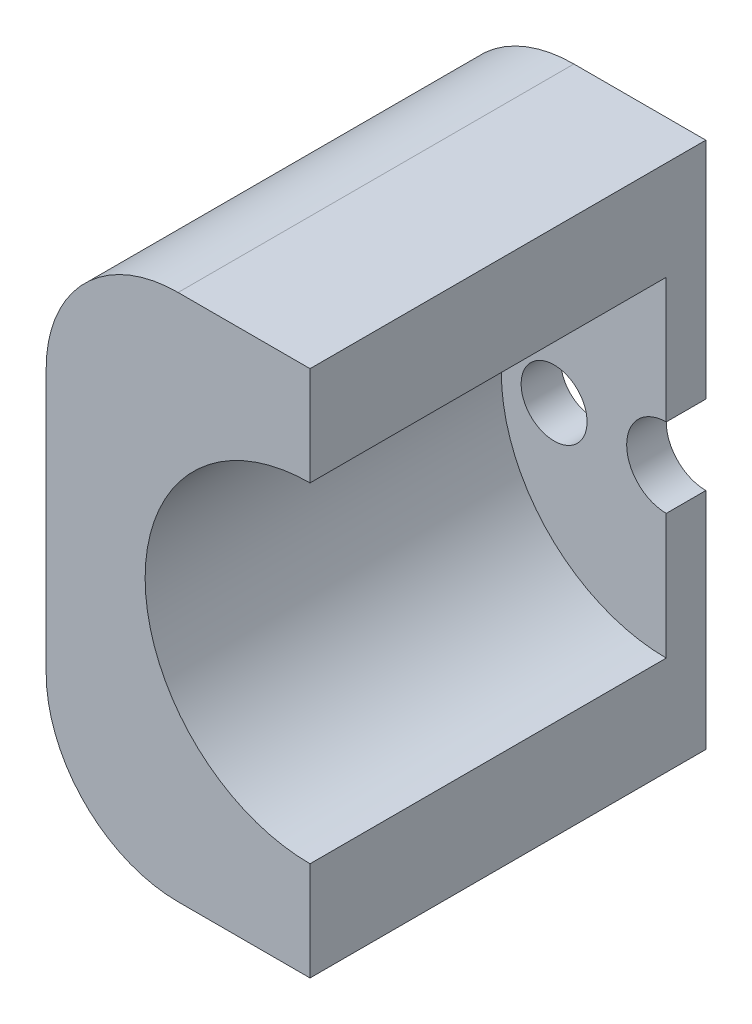
ISO-10303-21;
HEADER;
FILE_DESCRIPTION(('STEP AP214'),'2;1');
FILE_NAME('part.step','',(''),(''),'','','');
FILE_SCHEMA(('AUTOMOTIVE_DESIGN { 1 0 10303 214 1 1 1 1 }'));
ENDSEC;
DATA;
#1=APPLICATION_CONTEXT('core data for automotive mechanical design processes');
#2=APPLICATION_PROTOCOL_DEFINITION('international standard','automotive_design',2000,#1);
#3=PRODUCT_CONTEXT('',#1,'mechanical');
#4=PRODUCT('Part','Part','',(#3));
#5=PRODUCT_RELATED_PRODUCT_CATEGORY('part','',(#4));
#6=PRODUCT_DEFINITION_FORMATION('','',#4);
#7=PRODUCT_DEFINITION_CONTEXT('part definition',#1,'design');
#8=PRODUCT_DEFINITION('design','',#6,#7);
#9=PRODUCT_DEFINITION_SHAPE('','',#8);
#10=(LENGTH_UNIT() NAMED_UNIT(*) SI_UNIT(.MILLI.,.METRE.));
#11=(NAMED_UNIT(*) PLANE_ANGLE_UNIT() SI_UNIT($,.RADIAN.));
#12=(NAMED_UNIT(*) SI_UNIT($,.STERADIAN.) SOLID_ANGLE_UNIT());
#13=UNCERTAINTY_MEASURE_WITH_UNIT(LENGTH_MEASURE(1.E-05),#10,'distance_accuracy_value','');
#14=(GEOMETRIC_REPRESENTATION_CONTEXT(3) GLOBAL_UNCERTAINTY_ASSIGNED_CONTEXT((#13)) GLOBAL_UNIT_ASSIGNED_CONTEXT((#10,
#11,#12)) REPRESENTATION_CONTEXT('',''));
#15=CARTESIAN_POINT('',(0.,0.,0.));
#16=DIRECTION('',(0.,0.,1.));
#17=DIRECTION('',(1.,0.,0.));
#18=AXIS2_PLACEMENT_3D('',#15,#16,#17);
#19=CARTESIAN_POINT('',(0.,0.,30.));
#20=DIRECTION('',(0.,0.,-1.));
#21=DIRECTION('',(-1.,0.,0.));
#22=AXIS2_PLACEMENT_3D('',#19,#20,#21);
#23=CYLINDRICAL_SURFACE('',#22,12.5);
#24=CARTESIAN_POINT('',(0.,0.,3.));
#25=DIRECTION('',(0.,0.,-1.));
#26=DIRECTION('',(-1.,0.,0.));
#27=AXIS2_PLACEMENT_3D('',#24,#25,#26);
#28=CIRCLE('',#27,12.5);
#29=CARTESIAN_POINT('',(0.,-12.5,3.));
#30=VERTEX_POINT('',#29);
#31=CARTESIAN_POINT('',(0.,12.5,3.));
#32=VERTEX_POINT('',#31);
#33=EDGE_CURVE('E139',#30,#32,#28,.T.);
#34=ORIENTED_EDGE('',*,*,#33,.T.);
#35=DIRECTION('',(0.,0.,-1.));
#36=VECTOR('',#35,1.);
#37=CARTESIAN_POINT('',(0.,12.5,30.));
#38=LINE('',#37,#36);
#39=CARTESIAN_POINT('',(0.,12.5,30.));
#40=VERTEX_POINT('',#39);
#41=EDGE_CURVE('E138',#40,#32,#38,.T.);
#42=ORIENTED_EDGE('',*,*,#41,.F.);
#43=CARTESIAN_POINT('',(0.,0.,30.));
#44=DIRECTION('',(0.,0.,-1.));
#45=DIRECTION('',(1.,0.,0.));
#46=AXIS2_PLACEMENT_3D('',#43,#44,#45);
#47=CIRCLE('',#46,12.5);
#48=CARTESIAN_POINT('',(0.,-12.5,30.));
#49=VERTEX_POINT('',#48);
#50=EDGE_CURVE('E149',#49,#40,#47,.T.);
#51=ORIENTED_EDGE('',*,*,#50,.F.);
#52=DIRECTION('',(0.,0.,-1.));
#53=VECTOR('',#52,1.);
#54=CARTESIAN_POINT('',(0.,-12.5,30.));
#55=LINE('',#54,#53);
#56=EDGE_CURVE('E163',#49,#30,#55,.T.);
#57=ORIENTED_EDGE('',*,*,#56,.T.);
#58=EDGE_LOOP('',(#34,#42,#51,#57));
#59=FACE_BOUND('',#58,.T.);
#60=ADVANCED_FACE('F35',(#59),#23,.F.);
#61=CARTESIAN_POINT('',(0.,20.,30.));
#62=DIRECTION('',(-1.,0.,0.));
#63=DIRECTION('',(0.,-1.,0.));
#64=AXIS2_PLACEMENT_3D('',#61,#62,#63);
#65=PLANE('',#64);
#66=DIRECTION('',(0.,1.,0.));
#67=VECTOR('',#66,1.);
#68=CARTESIAN_POINT('',(0.,20.,0.));
#69=LINE('',#68,#67);
#70=CARTESIAN_POINT('',(0.,3.,0.));
#71=VERTEX_POINT('',#70);
#72=CARTESIAN_POINT('',(0.,20.,0.));
#73=VERTEX_POINT('',#72);
#74=EDGE_CURVE('E147',#71,#73,#69,.T.);
#75=ORIENTED_EDGE('',*,*,#74,.T.);
#76=DIRECTION('',(0.,0.,-1.));
#77=VECTOR('',#76,1.);
#78=CARTESIAN_POINT('',(0.,20.,30.));
#79=LINE('',#78,#77);
#80=CARTESIAN_POINT('',(0.,20.,30.));
#81=VERTEX_POINT('',#80);
#82=EDGE_CURVE('E176',#81,#73,#79,.T.);
#83=ORIENTED_EDGE('',*,*,#82,.F.);
#84=DIRECTION('',(0.,1.,0.));
#85=VECTOR('',#84,1.);
#86=CARTESIAN_POINT('',(0.,20.,30.));
#87=LINE('',#86,#85);
#88=EDGE_CURVE('E152',#40,#81,#87,.T.);
#89=ORIENTED_EDGE('',*,*,#88,.F.);
#90=ORIENTED_EDGE('',*,*,#41,.T.);
#91=DIRECTION('',(0.,-1.,0.));
#92=VECTOR('',#91,1.);
#93=CARTESIAN_POINT('',(0.,3.,3.));
#94=LINE('',#93,#92);
#95=CARTESIAN_POINT('',(0.,3.,3.));
#96=VERTEX_POINT('',#95);
#97=EDGE_CURVE('E132',#32,#96,#94,.T.);
#98=ORIENTED_EDGE('',*,*,#97,.T.);
#99=DIRECTION('',(0.,0.,-1.));
#100=VECTOR('',#99,1.);
#101=CARTESIAN_POINT('',(0.,3.,3.));
#102=LINE('',#101,#100);
#103=EDGE_CURVE('E115',#96,#71,#102,.T.);
#104=ORIENTED_EDGE('',*,*,#103,.T.);
#105=EDGE_LOOP('',(#75,#83,#89,#90,#98,#104));
#106=FACE_BOUND('',#105,.T.);
#107=ADVANCED_FACE('F136',(#106),#65,.F.);
#108=CARTESIAN_POINT('',(-20.,20.,30.));
#109=DIRECTION('',(0.,-1.,0.));
#110=DIRECTION('',(0.,0.,-1.));
#111=AXIS2_PLACEMENT_3D('',#108,#109,#110);
#112=PLANE('',#111);
#113=DIRECTION('',(-1.,0.,0.));
#114=VECTOR('',#113,1.);
#115=CARTESIAN_POINT('',(-20.,20.,0.));
#116=LINE('',#115,#114);
#117=CARTESIAN_POINT('',(-10.,20.,0.));
#118=VERTEX_POINT('',#117);
#119=EDGE_CURVE('E165',#73,#118,#116,.T.);
#120=ORIENTED_EDGE('',*,*,#119,.T.);
#121=DIRECTION('',(0.,0.,-1.));
#122=VECTOR('',#121,1.);
#123=CARTESIAN_POINT('',(-10.,20.,30.));
#124=LINE('',#123,#122);
#125=CARTESIAN_POINT('',(-10.,20.,30.));
#126=VERTEX_POINT('',#125);
#127=EDGE_CURVE('E11',#118,#126,#124,.F.);
#128=ORIENTED_EDGE('',*,*,#127,.T.);
#129=DIRECTION('',(-1.,0.,0.));
#130=VECTOR('',#129,1.);
#131=CARTESIAN_POINT('',(-20.,20.,30.));
#132=LINE('',#131,#130);
#133=EDGE_CURVE('E155',#81,#126,#132,.T.);
#134=ORIENTED_EDGE('',*,*,#133,.F.);
#135=ORIENTED_EDGE('',*,*,#82,.T.);
#136=EDGE_LOOP('',(#120,#128,#134,#135));
#137=FACE_BOUND('',#136,.T.);
#138=ADVANCED_FACE('F214',(#137),#112,.F.);
#139=CARTESIAN_POINT('',(-20.,20.,30.));
#140=DIRECTION('',(1.,0.,0.));
#141=DIRECTION('',(0.,0.,-1.));
#142=AXIS2_PLACEMENT_3D('',#139,#140,#141);
#143=PLANE('',#142);
#144=DIRECTION('',(0.,-1.,0.));
#145=VECTOR('',#144,1.);
#146=CARTESIAN_POINT('',(-20.,20.,0.));
#147=LINE('',#146,#145);
#148=CARTESIAN_POINT('',(-20.,10.,0.));
#149=VERTEX_POINT('',#148);
#150=CARTESIAN_POINT('',(-20.,-10.,0.));
#151=VERTEX_POINT('',#150);
#152=EDGE_CURVE('E167',#149,#151,#147,.T.);
#153=ORIENTED_EDGE('',*,*,#152,.T.);
#154=DIRECTION('',(0.,0.,-1.));
#155=VECTOR('',#154,1.);
#156=CARTESIAN_POINT('',(-20.,-10.,30.));
#157=LINE('',#156,#155);
#158=CARTESIAN_POINT('',(-20.,-10.,30.));
#159=VERTEX_POINT('',#158);
#160=EDGE_CURVE('E56',#151,#159,#157,.F.);
#161=ORIENTED_EDGE('',*,*,#160,.T.);
#162=DIRECTION('',(0.,-1.,0.));
#163=VECTOR('',#162,1.);
#164=CARTESIAN_POINT('',(-20.,20.,30.));
#165=LINE('',#164,#163);
#166=CARTESIAN_POINT('',(-20.,10.,30.));
#167=VERTEX_POINT('',#166);
#168=EDGE_CURVE('E157',#167,#159,#165,.T.);
#169=ORIENTED_EDGE('',*,*,#168,.F.);
#170=DIRECTION('',(0.,0.,-1.));
#171=VECTOR('',#170,1.);
#172=CARTESIAN_POINT('',(-20.,10.,30.));
#173=LINE('',#172,#171);
#174=EDGE_CURVE('E187',#167,#149,#173,.T.);
#175=ORIENTED_EDGE('',*,*,#174,.T.);
#176=EDGE_LOOP('',(#153,#161,#169,#175));
#177=FACE_BOUND('',#176,.T.);
#178=ADVANCED_FACE('F209',(#177),#143,.F.);
#179=CARTESIAN_POINT('',(-20.,-20.,30.));
#180=DIRECTION('',(0.,1.,0.));
#181=DIRECTION('',(0.,0.,1.));
#182=AXIS2_PLACEMENT_3D('',#179,#180,#181);
#183=PLANE('',#182);
#184=DIRECTION('',(1.,0.,0.));
#185=VECTOR('',#184,1.);
#186=CARTESIAN_POINT('',(-20.,-20.,30.));
#187=LINE('',#186,#185);
#188=CARTESIAN_POINT('',(-10.,-20.,30.));
#189=VERTEX_POINT('',#188);
#190=CARTESIAN_POINT('',(0.,-20.,30.));
#191=VERTEX_POINT('',#190);
#192=EDGE_CURVE('E159',#189,#191,#187,.T.);
#193=ORIENTED_EDGE('',*,*,#192,.F.);
#194=DIRECTION('',(0.,0.,-1.));
#195=VECTOR('',#194,1.);
#196=CARTESIAN_POINT('',(-10.,-20.,30.));
#197=LINE('',#196,#195);
#198=CARTESIAN_POINT('',(-10.,-20.,0.));
#199=VERTEX_POINT('',#198);
#200=EDGE_CURVE('E180',#189,#199,#197,.T.);
#201=ORIENTED_EDGE('',*,*,#200,.T.);
#202=DIRECTION('',(1.,0.,0.));
#203=VECTOR('',#202,1.);
#204=CARTESIAN_POINT('',(-20.,-20.,0.));
#205=LINE('',#204,#203);
#206=CARTESIAN_POINT('',(0.,-20.,0.));
#207=VERTEX_POINT('',#206);
#208=EDGE_CURVE('E169',#199,#207,#205,.T.);
#209=ORIENTED_EDGE('',*,*,#208,.T.);
#210=DIRECTION('',(0.,0.,-1.));
#211=VECTOR('',#210,1.);
#212=CARTESIAN_POINT('',(0.,-20.,30.));
#213=LINE('',#212,#211);
#214=EDGE_CURVE('E173',#191,#207,#213,.T.);
#215=ORIENTED_EDGE('',*,*,#214,.F.);
#216=EDGE_LOOP('',(#193,#201,#209,#215));
#217=FACE_BOUND('',#216,.T.);
#218=ADVANCED_FACE('F200',(#217),#183,.F.);
#219=CARTESIAN_POINT('',(0.,-20.,30.));
#220=DIRECTION('',(-1.,0.,0.));
#221=DIRECTION('',(0.,-1.,0.));
#222=AXIS2_PLACEMENT_3D('',#219,#220,#221);
#223=PLANE('',#222);
#224=DIRECTION('',(0.,1.,0.));
#225=VECTOR('',#224,1.);
#226=CARTESIAN_POINT('',(0.,-20.,0.));
#227=LINE('',#226,#225);
#228=CARTESIAN_POINT('',(0.,-3.,0.));
#229=VERTEX_POINT('',#228);
#230=EDGE_CURVE('E153',#207,#229,#227,.T.);
#231=ORIENTED_EDGE('',*,*,#230,.T.);
#232=DIRECTION('',(0.,0.,-1.));
#233=VECTOR('',#232,1.);
#234=CARTESIAN_POINT('',(0.,-3.,3.));
#235=LINE('',#234,#233);
#236=CARTESIAN_POINT('',(0.,-3.,3.));
#237=VERTEX_POINT('',#236);
#238=EDGE_CURVE('E125',#237,#229,#235,.T.);
#239=ORIENTED_EDGE('',*,*,#238,.F.);
#240=DIRECTION('',(0.,-1.,0.));
#241=VECTOR('',#240,1.);
#242=CARTESIAN_POINT('',(0.,-12.5,3.));
#243=LINE('',#242,#241);
#244=EDGE_CURVE('E126',#237,#30,#243,.T.);
#245=ORIENTED_EDGE('',*,*,#244,.T.);
#246=ORIENTED_EDGE('',*,*,#56,.F.);
#247=DIRECTION('',(0.,1.,0.));
#248=VECTOR('',#247,1.);
#249=CARTESIAN_POINT('',(0.,-20.,30.));
#250=LINE('',#249,#248);
#251=EDGE_CURVE('E161',#191,#49,#250,.T.);
#252=ORIENTED_EDGE('',*,*,#251,.F.);
#253=ORIENTED_EDGE('',*,*,#214,.T.);
#254=EDGE_LOOP('',(#231,#239,#245,#246,#252,#253));
#255=FACE_BOUND('',#254,.T.);
#256=ADVANCED_FACE('F217',(#255),#223,.F.);
#257=CARTESIAN_POINT('',(0.,0.,30.));
#258=DIRECTION('',(0.,0.,1.));
#259=DIRECTION('',(1.,0.,0.));
#260=AXIS2_PLACEMENT_3D('',#257,#258,#259);
#261=PLANE('',#260);
#262=ORIENTED_EDGE('',*,*,#168,.T.);
#263=CARTESIAN_POINT('',(-10.,-10.,30.));
#264=DIRECTION('',(0.,0.,1.));
#265=DIRECTION('',(1.,0.,0.));
#266=AXIS2_PLACEMENT_3D('',#263,#264,#265);
#267=CIRCLE('',#266,10.);
#268=EDGE_CURVE('E43',#159,#189,#267,.T.);
#269=ORIENTED_EDGE('',*,*,#268,.T.);
#270=ORIENTED_EDGE('',*,*,#192,.T.);
#271=ORIENTED_EDGE('',*,*,#251,.T.);
#272=ORIENTED_EDGE('',*,*,#50,.T.);
#273=ORIENTED_EDGE('',*,*,#88,.T.);
#274=ORIENTED_EDGE('',*,*,#133,.T.);
#275=CARTESIAN_POINT('',(-10.,10.,30.));
#276=DIRECTION('',(0.,0.,1.));
#277=DIRECTION('',(1.,0.,0.));
#278=AXIS2_PLACEMENT_3D('',#275,#276,#277);
#279=CIRCLE('',#278,10.);
#280=EDGE_CURVE('E191',#126,#167,#279,.T.);
#281=ORIENTED_EDGE('',*,*,#280,.T.);
#282=EDGE_LOOP('',(#262,#269,#270,#271,#272,#273,#274,#281));
#283=FACE_BOUND('',#282,.T.);
#284=ADVANCED_FACE('F195',(#283),#261,.T.);
#285=CARTESIAN_POINT('',(0.,0.,0.));
#286=DIRECTION('',(0.,0.,1.));
#287=DIRECTION('',(1.,0.,0.));
#288=AXIS2_PLACEMENT_3D('',#285,#286,#287);
#289=PLANE('',#288);
#290=ORIENTED_EDGE('',*,*,#208,.F.);
#291=CARTESIAN_POINT('',(-10.,-10.,0.));
#292=DIRECTION('',(0.,0.,1.));
#293=DIRECTION('',(1.,0.,0.));
#294=AXIS2_PLACEMENT_3D('',#291,#292,#293);
#295=CIRCLE('',#294,10.);
#296=EDGE_CURVE('E185',#199,#151,#295,.F.);
#297=ORIENTED_EDGE('',*,*,#296,.T.);
#298=ORIENTED_EDGE('',*,*,#152,.F.);
#299=CARTESIAN_POINT('',(-10.,10.,0.));
#300=DIRECTION('',(0.,0.,1.));
#301=DIRECTION('',(1.,0.,0.));
#302=AXIS2_PLACEMENT_3D('',#299,#300,#301);
#303=CIRCLE('',#302,10.);
#304=EDGE_CURVE('E183',#149,#118,#303,.F.);
#305=ORIENTED_EDGE('',*,*,#304,.T.);
#306=ORIENTED_EDGE('',*,*,#119,.F.);
#307=ORIENTED_EDGE('',*,*,#74,.F.);
#308=CARTESIAN_POINT('',(0.,0.,0.));
#309=DIRECTION('',(0.,0.,1.));
#310=DIRECTION('',(-1.,0.,0.));
#311=AXIS2_PLACEMENT_3D('',#308,#309,#310);
#312=CIRCLE('',#311,3.);
#313=EDGE_CURVE('E122',#71,#229,#312,.T.);
#314=ORIENTED_EDGE('',*,*,#313,.T.);
#315=ORIENTED_EDGE('',*,*,#230,.F.);
#316=EDGE_LOOP('',(#290,#297,#298,#305,#306,#307,#314,#315));
#317=FACE_BOUND('',#316,.T.);
#318=CARTESIAN_POINT('',(-8.50000000000005,0.,0.));
#319=DIRECTION('',(0.,0.,-1.));
#320=DIRECTION('',(-1.,0.,0.));
#321=AXIS2_PLACEMENT_3D('',#318,#319,#320);
#322=CIRCLE('',#321,2.5);
#323=CARTESIAN_POINT('',(-11.,0.,0.));
#324=VERTEX_POINT('',#323);
#325=EDGE_CURVE('E340',#324,#324,#322,.T.);
#326=ORIENTED_EDGE('',*,*,#325,.F.);
#327=EDGE_LOOP('',(#326));
#328=FACE_BOUND('',#327,.T.);
#329=ADVANCED_FACE('F206',(#317,#328),#289,.F.);
#330=CARTESIAN_POINT('',(0.,0.,3.));
#331=DIRECTION('',(0.,0.,-1.));
#332=DIRECTION('',(-1.,0.,0.));
#333=AXIS2_PLACEMENT_3D('',#330,#331,#332);
#334=CYLINDRICAL_SURFACE('',#333,3.);
#335=ORIENTED_EDGE('',*,*,#313,.F.);
#336=ORIENTED_EDGE('',*,*,#103,.F.);
#337=CARTESIAN_POINT('',(0.,0.,3.));
#338=DIRECTION('',(0.,0.,1.));
#339=DIRECTION('',(-1.,0.,0.));
#340=AXIS2_PLACEMENT_3D('',#337,#338,#339);
#341=CIRCLE('',#340,3.);
#342=EDGE_CURVE('E119',#96,#237,#341,.T.);
#343=ORIENTED_EDGE('',*,*,#342,.T.);
#344=ORIENTED_EDGE('',*,*,#238,.T.);
#345=EDGE_LOOP('',(#335,#336,#343,#344));
#346=FACE_BOUND('',#345,.T.);
#347=ADVANCED_FACE('F117',(#346),#334,.F.);
#348=CARTESIAN_POINT('',(0.,0.,3.));
#349=DIRECTION('',(0.,0.,-1.));
#350=DIRECTION('',(-1.,0.,0.));
#351=AXIS2_PLACEMENT_3D('',#348,#349,#350);
#352=PLANE('',#351);
#353=CARTESIAN_POINT('',(-8.50000000000005,0.,3.));
#354=DIRECTION('',(0.,0.,-1.));
#355=DIRECTION('',(-1.,0.,0.));
#356=AXIS2_PLACEMENT_3D('',#353,#354,#355);
#357=CIRCLE('',#356,2.5);
#358=CARTESIAN_POINT('',(-11.,0.,3.));
#359=VERTEX_POINT('',#358);
#360=EDGE_CURVE('E146',#359,#359,#357,.T.);
#361=ORIENTED_EDGE('',*,*,#360,.T.);
#362=EDGE_LOOP('',(#361));
#363=FACE_BOUND('',#362,.T.);
#364=ORIENTED_EDGE('',*,*,#33,.F.);
#365=ORIENTED_EDGE('',*,*,#244,.F.);
#366=ORIENTED_EDGE('',*,*,#342,.F.);
#367=ORIENTED_EDGE('',*,*,#97,.F.);
#368=EDGE_LOOP('',(#364,#365,#366,#367));
#369=FACE_BOUND('',#368,.T.);
#370=ADVANCED_FACE('F131',(#363,#369),#352,.F.);
#371=CARTESIAN_POINT('',(-8.50000000000005,0.,3.));
#372=DIRECTION('',(0.,0.,-1.));
#373=DIRECTION('',(-1.,0.,0.));
#374=AXIS2_PLACEMENT_3D('',#371,#372,#373);
#375=CYLINDRICAL_SURFACE('',#374,2.5);
#376=ORIENTED_EDGE('',*,*,#360,.F.);
#377=EDGE_LOOP('',(#376));
#378=FACE_BOUND('',#377,.T.);
#379=ORIENTED_EDGE('',*,*,#325,.T.);
#380=EDGE_LOOP('',(#379));
#381=FACE_BOUND('',#380,.T.);
#382=ADVANCED_FACE('F229',(#378,#381),#375,.F.);
#383=CARTESIAN_POINT('',(-10.,-10.,30.));
#384=DIRECTION('',(0.,0.,-1.));
#385=DIRECTION('',(-1.,0.,0.));
#386=AXIS2_PLACEMENT_3D('',#383,#384,#385);
#387=CYLINDRICAL_SURFACE('',#386,10.);
#388=ORIENTED_EDGE('',*,*,#268,.F.);
#389=ORIENTED_EDGE('',*,*,#160,.F.);
#390=ORIENTED_EDGE('',*,*,#296,.F.);
#391=ORIENTED_EDGE('',*,*,#200,.F.);
#392=EDGE_LOOP('',(#388,#389,#390,#391));
#393=FACE_BOUND('',#392,.T.);
#394=ADVANCED_FACE('F203',(#393),#387,.T.);
#395=CARTESIAN_POINT('',(-10.,10.,30.));
#396=DIRECTION('',(0.,0.,-1.));
#397=DIRECTION('',(-1.,0.,0.));
#398=AXIS2_PLACEMENT_3D('',#395,#396,#397);
#399=CYLINDRICAL_SURFACE('',#398,10.);
#400=ORIENTED_EDGE('',*,*,#280,.F.);
#401=ORIENTED_EDGE('',*,*,#127,.F.);
#402=ORIENTED_EDGE('',*,*,#304,.F.);
#403=ORIENTED_EDGE('',*,*,#174,.F.);
#404=EDGE_LOOP('',(#400,#401,#402,#403));
#405=FACE_BOUND('',#404,.T.);
#406=ADVANCED_FACE('F37',(#405),#399,.T.);
#407=CLOSED_SHELL('',(#60,#107,#138,#178,#218,#256,#284,#329,#347,#370,#382,#394,#406));
#408=MANIFOLD_SOLID_BREP('B2',#407);
#409=ADVANCED_BREP_SHAPE_REPRESENTATION('',(#18,#408),#14);
#410=SHAPE_DEFINITION_REPRESENTATION(#9,#409);
ENDSEC;
END-ISO-10303-21;
